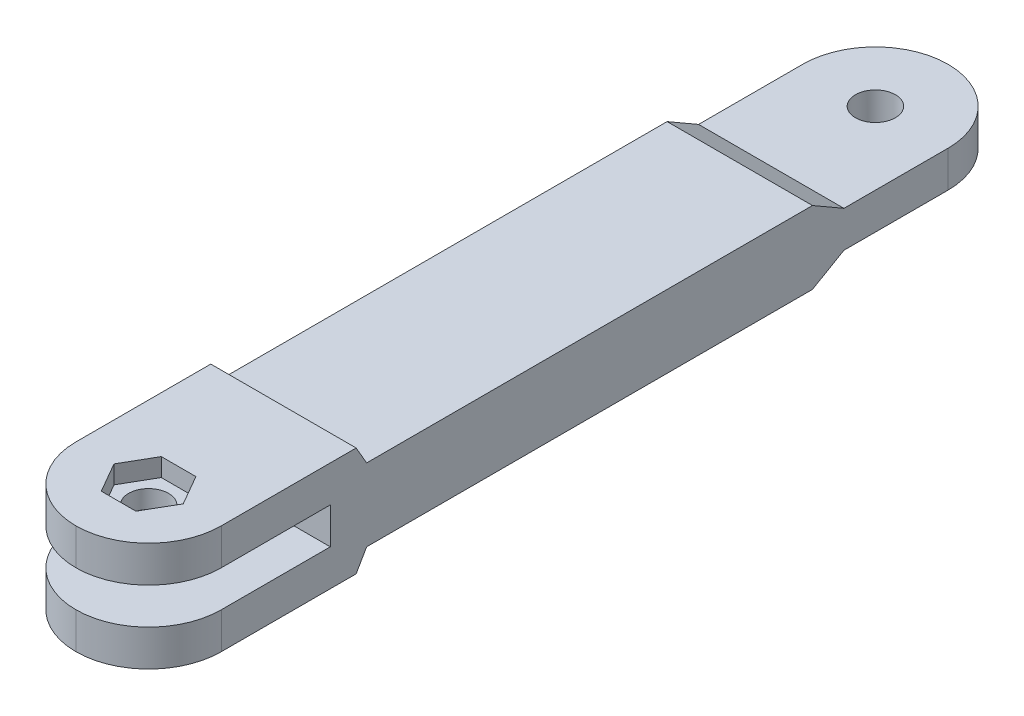
ISO-10303-21;
HEADER;
FILE_DESCRIPTION(('STEP AP214'),'2;1');
FILE_NAME('part.step','',(''),(''),'','','');
FILE_SCHEMA(('AUTOMOTIVE_DESIGN { 1 0 10303 214 1 1 1 1 }'));
ENDSEC;
DATA;
#1=APPLICATION_CONTEXT('core data for automotive mechanical design processes');
#2=APPLICATION_PROTOCOL_DEFINITION('international standard','automotive_design',2000,#1);
#3=PRODUCT_CONTEXT('',#1,'mechanical');
#4=PRODUCT('Part','Part','',(#3));
#5=PRODUCT_RELATED_PRODUCT_CATEGORY('part','',(#4));
#6=PRODUCT_DEFINITION_FORMATION('','',#4);
#7=PRODUCT_DEFINITION_CONTEXT('part definition',#1,'design');
#8=PRODUCT_DEFINITION('design','',#6,#7);
#9=PRODUCT_DEFINITION_SHAPE('','',#8);
#10=(LENGTH_UNIT() NAMED_UNIT(*) SI_UNIT(.MILLI.,.METRE.));
#11=(NAMED_UNIT(*) PLANE_ANGLE_UNIT() SI_UNIT($,.RADIAN.));
#12=(NAMED_UNIT(*) SI_UNIT($,.STERADIAN.) SOLID_ANGLE_UNIT());
#13=UNCERTAINTY_MEASURE_WITH_UNIT(LENGTH_MEASURE(1.E-05),#10,'distance_accuracy_value','');
#14=(GEOMETRIC_REPRESENTATION_CONTEXT(3) GLOBAL_UNCERTAINTY_ASSIGNED_CONTEXT((#13)) GLOBAL_UNIT_ASSIGNED_CONTEXT((#10,
#11,#12)) REPRESENTATION_CONTEXT('',''));
#15=CARTESIAN_POINT('',(0.,0.,0.));
#16=DIRECTION('',(0.,0.,1.));
#17=DIRECTION('',(1.,0.,0.));
#18=AXIS2_PLACEMENT_3D('',#15,#16,#17);
#19=CARTESIAN_POINT('',(-10.,7.5,62.5));
#20=DIRECTION('',(0.,-1.,0.));
#21=DIRECTION('',(0.,0.,-1.));
#22=AXIS2_PLACEMENT_3D('',#19,#20,#21);
#23=PLANE('',#22);
#24=DIRECTION('',(0.,0.,-1.));
#25=VECTOR('',#24,1.);
#26=CARTESIAN_POINT('',(-10.,7.5,62.5));
#27=LINE('',#26,#25);
#28=CARTESIAN_POINT('',(-10.,7.5,52.5));
#29=VERTEX_POINT('',#28);
#30=CARTESIAN_POINT('',(-10.,7.5,33.943375672974));
#31=VERTEX_POINT('',#30);
#32=EDGE_CURVE('E298',#29,#31,#27,.T.);
#33=ORIENTED_EDGE('',*,*,#32,.F.);
#34=CARTESIAN_POINT('',(0.,7.5,52.5));
#35=DIRECTION('',(0.,-1.,0.));
#36=DIRECTION('',(0.,0.,-1.));
#37=AXIS2_PLACEMENT_3D('',#34,#35,#36);
#38=CIRCLE('',#37,10.);
#39=CARTESIAN_POINT('',(0.,7.5,62.5));
#40=VERTEX_POINT('',#39);
#41=EDGE_CURVE('E64',#29,#40,#38,.F.);
#42=ORIENTED_EDGE('',*,*,#41,.T.);
#43=CARTESIAN_POINT('',(0.,7.5,52.5));
#44=DIRECTION('',(0.,-1.,0.));
#45=DIRECTION('',(0.,0.,-1.));
#46=AXIS2_PLACEMENT_3D('',#43,#44,#45);
#47=CIRCLE('',#46,10.);
#48=CARTESIAN_POINT('',(10.,7.5,52.5));
#49=VERTEX_POINT('',#48);
#50=EDGE_CURVE('E455',#40,#49,#47,.F.);
#51=ORIENTED_EDGE('',*,*,#50,.T.);
#52=DIRECTION('',(0.,0.,-1.));
#53=VECTOR('',#52,1.);
#54=CARTESIAN_POINT('',(10.,7.5,62.5));
#55=LINE('',#54,#53);
#56=CARTESIAN_POINT('',(10.,7.5,33.943375672974));
#57=VERTEX_POINT('',#56);
#58=EDGE_CURVE('E301',#49,#57,#55,.T.);
#59=ORIENTED_EDGE('',*,*,#58,.T.);
#60=DIRECTION('',(-1.,0.,0.));
#61=VECTOR('',#60,1.);
#62=CARTESIAN_POINT('',(-10.,7.5,33.943375672974));
#63=LINE('',#62,#61);
#64=EDGE_CURVE('E399',#57,#31,#63,.T.);
#65=ORIENTED_EDGE('',*,*,#64,.T.);
#66=EDGE_LOOP('',(#33,#42,#51,#59,#65));
#67=FACE_BOUND('',#66,.T.);
#68=DIRECTION('',(-1.,0.,0.));
#69=VECTOR('',#68,1.);
#70=CARTESIAN_POINT('',(-10.,7.5,48.375));
#71=LINE('',#70,#69);
#72=CARTESIAN_POINT('',(2.38156986040721,7.5,48.375));
#73=VERTEX_POINT('',#72);
#74=CARTESIAN_POINT('',(-2.38156986040721,7.5,48.375));
#75=VERTEX_POINT('',#74);
#76=EDGE_CURVE('E11',#73,#75,#71,.T.);
#77=ORIENTED_EDGE('',*,*,#76,.F.);
#78=DIRECTION('',(-0.499999999999999,0.,-0.866025403784439));
#79=VECTOR('',#78,1.);
#80=CARTESIAN_POINT('',(5.40248180953301,7.5,53.6073729810778));
#81=LINE('',#80,#79);
#82=CARTESIAN_POINT('',(4.76313972081442,7.5,52.5));
#83=VERTEX_POINT('',#82);
#84=EDGE_CURVE('E466',#83,#73,#81,.T.);
#85=ORIENTED_EDGE('',*,*,#84,.F.);
#86=DIRECTION('',(0.5,0.,-0.866025403784439));
#87=VECTOR('',#86,1.);
#88=CARTESIAN_POINT('',(-3.25777222831138,7.5,66.3926270189222));
#89=LINE('',#88,#87);
#90=CARTESIAN_POINT('',(2.38156986040722,7.5,56.625));
#91=VERTEX_POINT('',#90);
#92=EDGE_CURVE('E484',#91,#83,#89,.T.);
#93=ORIENTED_EDGE('',*,*,#92,.F.);
#94=DIRECTION('',(1.,0.,0.));
#95=VECTOR('',#94,1.);
#96=CARTESIAN_POINT('',(-10.,7.5,56.625));
#97=LINE('',#96,#95);
#98=CARTESIAN_POINT('',(-2.3815698604072,7.5,56.625));
#99=VERTEX_POINT('',#98);
#100=EDGE_CURVE('E487',#99,#91,#97,.T.);
#101=ORIENTED_EDGE('',*,*,#100,.F.);
#102=DIRECTION('',(0.5,0.,0.866025403784439));
#103=VECTOR('',#102,1.);
#104=CARTESIAN_POINT('',(-1.74222777168861,7.5,57.7323729810778));
#105=LINE('',#104,#103);
#106=CARTESIAN_POINT('',(-4.76313972081442,7.5,52.5));
#107=VERTEX_POINT('',#106);
#108=EDGE_CURVE('E490',#107,#99,#105,.T.);
#109=ORIENTED_EDGE('',*,*,#108,.F.);
#110=DIRECTION('',(-0.500000000000001,0.,0.866025403784438));
#111=VECTOR('',#110,1.);
#112=CARTESIAN_POINT('',(-10.402481809533,7.5,62.2676270189222));
#113=LINE('',#112,#111);
#114=EDGE_CURVE('E49',#75,#107,#113,.T.);
#115=ORIENTED_EDGE('',*,*,#114,.F.);
#116=EDGE_LOOP('',(#77,#85,#93,#101,#109,#115));
#117=FACE_BOUND('',#116,.T.);
#118=ADVANCED_FACE('F40',(#67,#117),#23,.F.);
#119=CARTESIAN_POINT('',(0.,-7.5,52.5));
#120=DIRECTION('',(0.,1.,0.));
#121=DIRECTION('',(0.,0.,1.));
#122=AXIS2_PLACEMENT_3D('',#119,#120,#121);
#123=CYLINDRICAL_SURFACE('',#122,2.75);
#124=CARTESIAN_POINT('',(0.,2.5,52.5));
#125=DIRECTION('',(0.,1.,0.));
#126=DIRECTION('',(-1.,0.,0.));
#127=AXIS2_PLACEMENT_3D('',#124,#125,#126);
#128=CIRCLE('',#127,2.75);
#129=CARTESIAN_POINT('',(-2.75,2.5,52.5));
#130=VERTEX_POINT('',#129);
#131=EDGE_CURVE('E267',#130,#130,#128,.T.);
#132=ORIENTED_EDGE('',*,*,#131,.F.);
#133=EDGE_LOOP('',(#132));
#134=FACE_BOUND('',#133,.T.);
#135=CARTESIAN_POINT('',(0.,5.,52.5));
#136=DIRECTION('',(0.,1.,0.));
#137=DIRECTION('',(0.,0.,1.));
#138=AXIS2_PLACEMENT_3D('',#135,#136,#137);
#139=CIRCLE('',#138,2.75);
#140=CARTESIAN_POINT('',(0.,5.,55.25));
#141=VERTEX_POINT('',#140);
#142=EDGE_CURVE('E218',#141,#141,#139,.F.);
#143=ORIENTED_EDGE('',*,*,#142,.F.);
#144=EDGE_LOOP('',(#143));
#145=FACE_BOUND('',#144,.T.);
#146=ADVANCED_FACE('F518',(#134,#145),#123,.F.);
#147=CARTESIAN_POINT('',(0.,0.,37.5));
#148=DIRECTION('',(0.,0.,-1.));
#149=DIRECTION('',(-1.,0.,0.));
#150=AXIS2_PLACEMENT_3D('',#147,#148,#149);
#151=PLANE('',#150);
#152=DIRECTION('',(-1.,0.,0.));
#153=VECTOR('',#152,1.);
#154=CARTESIAN_POINT('',(-10.,-2.5,37.5));
#155=LINE('',#154,#153);
#156=CARTESIAN_POINT('',(10.,-2.5,37.5));
#157=VERTEX_POINT('',#156);
#158=CARTESIAN_POINT('',(-10.,-2.5,37.5));
#159=VERTEX_POINT('',#158);
#160=EDGE_CURVE('E277',#157,#159,#155,.T.);
#161=ORIENTED_EDGE('',*,*,#160,.F.);
#162=DIRECTION('',(0.,1.,0.));
#163=VECTOR('',#162,1.);
#164=CARTESIAN_POINT('',(10.,-5.,37.5));
#165=LINE('',#164,#163);
#166=CARTESIAN_POINT('',(10.,2.5,37.5));
#167=VERTEX_POINT('',#166);
#168=EDGE_CURVE('E327',#157,#167,#165,.T.);
#169=ORIENTED_EDGE('',*,*,#168,.T.);
#170=DIRECTION('',(1.,0.,0.));
#171=VECTOR('',#170,1.);
#172=CARTESIAN_POINT('',(-10.,2.5,37.5));
#173=LINE('',#172,#171);
#174=CARTESIAN_POINT('',(-10.,2.5,37.5));
#175=VERTEX_POINT('',#174);
#176=EDGE_CURVE('E294',#175,#167,#173,.T.);
#177=ORIENTED_EDGE('',*,*,#176,.F.);
#178=DIRECTION('',(0.,-1.,0.));
#179=VECTOR('',#178,1.);
#180=CARTESIAN_POINT('',(-10.,-5.,37.5));
#181=LINE('',#180,#179);
#182=EDGE_CURVE('E323',#175,#159,#181,.T.);
#183=ORIENTED_EDGE('',*,*,#182,.T.);
#184=EDGE_LOOP('',(#161,#169,#177,#183));
#185=FACE_BOUND('',#184,.T.);
#186=ADVANCED_FACE('F524',(#185),#151,.F.);
#187=CARTESIAN_POINT('',(-10.,-5.,-37.5));
#188=DIRECTION('',(-1.,0.,0.));
#189=DIRECTION('',(0.,0.,1.));
#190=AXIS2_PLACEMENT_3D('',#187,#188,#189);
#191=PLANE('',#190);
#192=DIRECTION('',(0.,0.,-1.));
#193=VECTOR('',#192,1.);
#194=CARTESIAN_POINT('',(-10.,-7.5,62.5));
#195=LINE('',#194,#193);
#196=CARTESIAN_POINT('',(-10.,-7.5,52.5));
#197=VERTEX_POINT('',#196);
#198=CARTESIAN_POINT('',(-10.,-7.5,33.943375672974));
#199=VERTEX_POINT('',#198);
#200=EDGE_CURVE('E281',#197,#199,#195,.T.);
#201=ORIENTED_EDGE('',*,*,#200,.F.);
#202=DIRECTION('',(0.,-1.,0.));
#203=VECTOR('',#202,1.);
#204=CARTESIAN_POINT('',(-10.,-5.,52.5));
#205=LINE('',#204,#203);
#206=CARTESIAN_POINT('',(-10.,-2.5,52.5));
#207=VERTEX_POINT('',#206);
#208=EDGE_CURVE('E439',#197,#207,#205,.F.);
#209=ORIENTED_EDGE('',*,*,#208,.T.);
#210=DIRECTION('',(0.,0.,-1.));
#211=VECTOR('',#210,1.);
#212=CARTESIAN_POINT('',(-10.,-2.5,62.5));
#213=LINE('',#212,#211);
#214=EDGE_CURVE('E285',#207,#159,#213,.T.);
#215=ORIENTED_EDGE('',*,*,#214,.T.);
#216=ORIENTED_EDGE('',*,*,#182,.F.);
#217=DIRECTION('',(0.,0.,-1.));
#218=VECTOR('',#217,1.);
#219=CARTESIAN_POINT('',(-10.,2.5,62.5));
#220=LINE('',#219,#218);
#221=CARTESIAN_POINT('',(-10.,2.5,52.5));
#222=VERTEX_POINT('',#221);
#223=EDGE_CURVE('E307',#222,#175,#220,.T.);
#224=ORIENTED_EDGE('',*,*,#223,.F.);
#225=DIRECTION('',(0.,-1.,0.));
#226=VECTOR('',#225,1.);
#227=CARTESIAN_POINT('',(-10.,-5.,52.5));
#228=LINE('',#227,#226);
#229=EDGE_CURVE('E435',#222,#29,#228,.F.);
#230=ORIENTED_EDGE('',*,*,#229,.T.);
#231=ORIENTED_EDGE('',*,*,#32,.T.);
#232=DIRECTION('',(0.,-0.866025403784441,-0.499999999999996));
#233=VECTOR('',#232,1.);
#234=CARTESIAN_POINT('',(-10.,13.6602540378446,37.5));
#235=LINE('',#234,#233);
#236=CARTESIAN_POINT('',(-10.,5.,32.4999999999999));
#237=VERTEX_POINT('',#236);
#238=EDGE_CURVE('E403',#31,#237,#235,.T.);
#239=ORIENTED_EDGE('',*,*,#238,.T.);
#240=DIRECTION('',(0.,0.,1.));
#241=VECTOR('',#240,1.);
#242=CARTESIAN_POINT('',(-10.,5.,-37.5));
#243=LINE('',#242,#241);
#244=CARTESIAN_POINT('',(-10.,5.,-28.8397459621554));
#245=VERTEX_POINT('',#244);
#246=EDGE_CURVE('E332',#245,#237,#243,.T.);
#247=ORIENTED_EDGE('',*,*,#246,.F.);
#248=DIRECTION('',(0.,0.499999999999997,0.866025403784441));
#249=VECTOR('',#248,1.);
#250=CARTESIAN_POINT('',(-10.,-1.25000000000003,-39.6650635094611));
#251=LINE('',#250,#249);
#252=CARTESIAN_POINT('',(-10.,2.5,-33.1698729810777));
#253=VERTEX_POINT('',#252);
#254=EDGE_CURVE('E388',#245,#253,#251,.F.);
#255=ORIENTED_EDGE('',*,*,#254,.T.);
#256=DIRECTION('',(0.,0.,1.));
#257=VECTOR('',#256,1.);
#258=CARTESIAN_POINT('',(-10.,2.5,-57.5));
#259=LINE('',#258,#257);
#260=CARTESIAN_POINT('',(-10.,2.5,-47.5));
#261=VERTEX_POINT('',#260);
#262=EDGE_CURVE('E314',#261,#253,#259,.T.);
#263=ORIENTED_EDGE('',*,*,#262,.F.);
#264=DIRECTION('',(0.,1.,0.));
#265=VECTOR('',#264,1.);
#266=CARTESIAN_POINT('',(-10.,-5.,-47.5));
#267=LINE('',#266,#265);
#268=CARTESIAN_POINT('',(-10.,-2.5,-47.5));
#269=VERTEX_POINT('',#268);
#270=EDGE_CURVE('E353',#261,#269,#267,.F.);
#271=ORIENTED_EDGE('',*,*,#270,.T.);
#272=DIRECTION('',(0.,0.,1.));
#273=VECTOR('',#272,1.);
#274=CARTESIAN_POINT('',(-10.,-2.5,-57.5));
#275=LINE('',#274,#273);
#276=CARTESIAN_POINT('',(-10.,-2.5,-33.1698729810777));
#277=VERTEX_POINT('',#276);
#278=EDGE_CURVE('E317',#269,#277,#275,.T.);
#279=ORIENTED_EDGE('',*,*,#278,.T.);
#280=DIRECTION('',(0.,0.499999999999997,-0.866025403784441));
#281=VECTOR('',#280,1.);
#282=CARTESIAN_POINT('',(-10.,-1.24999999999994,-35.3349364905389));
#283=LINE('',#282,#281);
#284=CARTESIAN_POINT('',(-10.,-5.,-28.8397459621554));
#285=VERTEX_POINT('',#284);
#286=EDGE_CURVE('E385',#277,#285,#283,.F.);
#287=ORIENTED_EDGE('',*,*,#286,.T.);
#288=DIRECTION('',(0.,0.,1.));
#289=VECTOR('',#288,1.);
#290=CARTESIAN_POINT('',(-10.,-5.,-37.5));
#291=LINE('',#290,#289);
#292=CARTESIAN_POINT('',(-10.,-5.,32.4999999999999));
#293=VERTEX_POINT('',#292);
#294=EDGE_CURVE('E331',#285,#293,#291,.T.);
#295=ORIENTED_EDGE('',*,*,#294,.T.);
#296=DIRECTION('',(0.,-0.866025403784441,0.499999999999996));
#297=VECTOR('',#296,1.);
#298=CARTESIAN_POINT('',(-10.,-13.6602540378446,37.5));
#299=LINE('',#298,#297);
#300=EDGE_CURVE('E417',#293,#199,#299,.T.);
#301=ORIENTED_EDGE('',*,*,#300,.T.);
#302=EDGE_LOOP('',(#201,#209,#215,#216,#224,#230,#231,#239,#247,#255,#263,#271,#279,#287,#295,#301));
#303=FACE_BOUND('',#302,.T.);
#304=ADVANCED_FACE('F549',(#303),#191,.T.);
#305=CARTESIAN_POINT('',(-10.,5.,-37.5));
#306=DIRECTION('',(0.,1.,0.));
#307=DIRECTION('',(0.,0.,1.));
#308=AXIS2_PLACEMENT_3D('',#305,#306,#307);
#309=PLANE('',#308);
#310=ORIENTED_EDGE('',*,*,#246,.T.);
#311=DIRECTION('',(1.,0.,0.));
#312=VECTOR('',#311,1.);
#313=CARTESIAN_POINT('',(-10.,5.,32.4999999999999));
#314=LINE('',#313,#312);
#315=CARTESIAN_POINT('',(10.,5.,32.4999999999999));
#316=VERTEX_POINT('',#315);
#317=EDGE_CURVE('E373',#237,#316,#314,.T.);
#318=ORIENTED_EDGE('',*,*,#317,.T.);
#319=DIRECTION('',(0.,0.,1.));
#320=VECTOR('',#319,1.);
#321=CARTESIAN_POINT('',(10.,5.,-37.5));
#322=LINE('',#321,#320);
#323=CARTESIAN_POINT('',(10.,5.,-28.8397459621554));
#324=VERTEX_POINT('',#323);
#325=EDGE_CURVE('E337',#324,#316,#322,.T.);
#326=ORIENTED_EDGE('',*,*,#325,.F.);
#327=DIRECTION('',(-1.,0.,0.));
#328=VECTOR('',#327,1.);
#329=CARTESIAN_POINT('',(-10.,5.,-28.8397459621554));
#330=LINE('',#329,#328);
#331=EDGE_CURVE('E366',#324,#245,#330,.T.);
#332=ORIENTED_EDGE('',*,*,#331,.T.);
#333=EDGE_LOOP('',(#310,#318,#326,#332));
#334=FACE_BOUND('',#333,.T.);
#335=ADVANCED_FACE('F551',(#334),#309,.T.);
#336=CARTESIAN_POINT('',(10.,-5.,-37.5));
#337=DIRECTION('',(1.,0.,0.));
#338=DIRECTION('',(0.,0.,-1.));
#339=AXIS2_PLACEMENT_3D('',#336,#337,#338);
#340=PLANE('',#339);
#341=DIRECTION('',(0.,0.,-1.));
#342=VECTOR('',#341,1.);
#343=CARTESIAN_POINT('',(10.,-2.5,62.5));
#344=LINE('',#343,#342);
#345=CARTESIAN_POINT('',(10.,-2.5,52.5));
#346=VERTEX_POINT('',#345);
#347=EDGE_CURVE('E288',#346,#157,#344,.T.);
#348=ORIENTED_EDGE('',*,*,#347,.F.);
#349=DIRECTION('',(0.,1.,0.));
#350=VECTOR('',#349,1.);
#351=CARTESIAN_POINT('',(10.,-5.,52.5));
#352=LINE('',#351,#350);
#353=CARTESIAN_POINT('',(10.,-7.5,52.5));
#354=VERTEX_POINT('',#353);
#355=EDGE_CURVE('E463',#346,#354,#352,.F.);
#356=ORIENTED_EDGE('',*,*,#355,.T.);
#357=DIRECTION('',(0.,0.,-1.));
#358=VECTOR('',#357,1.);
#359=CARTESIAN_POINT('',(10.,-7.5,62.5));
#360=LINE('',#359,#358);
#361=CARTESIAN_POINT('',(10.,-7.5,33.943375672974));
#362=VERTEX_POINT('',#361);
#363=EDGE_CURVE('E291',#354,#362,#360,.T.);
#364=ORIENTED_EDGE('',*,*,#363,.T.);
#365=DIRECTION('',(0.,0.866025403784441,-0.499999999999996));
#366=VECTOR('',#365,1.);
#367=CARTESIAN_POINT('',(10.,-13.6602540378446,37.5));
#368=LINE('',#367,#366);
#369=CARTESIAN_POINT('',(10.,-5.,32.4999999999999));
#370=VERTEX_POINT('',#369);
#371=EDGE_CURVE('E414',#362,#370,#368,.T.);
#372=ORIENTED_EDGE('',*,*,#371,.T.);
#373=DIRECTION('',(0.,0.,1.));
#374=VECTOR('',#373,1.);
#375=CARTESIAN_POINT('',(10.,-5.,-37.5));
#376=LINE('',#375,#374);
#377=CARTESIAN_POINT('',(10.,-5.,-28.8397459621554));
#378=VERTEX_POINT('',#377);
#379=EDGE_CURVE('E341',#378,#370,#376,.T.);
#380=ORIENTED_EDGE('',*,*,#379,.F.);
#381=DIRECTION('',(0.,-0.499999999999997,0.866025403784441));
#382=VECTOR('',#381,1.);
#383=CARTESIAN_POINT('',(10.,-1.24999999999994,-35.3349364905389));
#384=LINE('',#383,#382);
#385=CARTESIAN_POINT('',(10.,-2.5,-33.1698729810777));
#386=VERTEX_POINT('',#385);
#387=EDGE_CURVE('E392',#378,#386,#384,.F.);
#388=ORIENTED_EDGE('',*,*,#387,.T.);
#389=DIRECTION('',(0.,0.,1.));
#390=VECTOR('',#389,1.);
#391=CARTESIAN_POINT('',(10.,-2.5,-57.5));
#392=LINE('',#391,#390);
#393=CARTESIAN_POINT('',(10.,-2.5,-47.5));
#394=VERTEX_POINT('',#393);
#395=EDGE_CURVE('E320',#394,#386,#392,.T.);
#396=ORIENTED_EDGE('',*,*,#395,.F.);
#397=DIRECTION('',(0.,-1.,0.));
#398=VECTOR('',#397,1.);
#399=CARTESIAN_POINT('',(10.,-5.,-47.5));
#400=LINE('',#399,#398);
#401=CARTESIAN_POINT('',(10.,2.5,-47.5));
#402=VERTEX_POINT('',#401);
#403=EDGE_CURVE('E363',#394,#402,#400,.F.);
#404=ORIENTED_EDGE('',*,*,#403,.T.);
#405=DIRECTION('',(0.,0.,1.));
#406=VECTOR('',#405,1.);
#407=CARTESIAN_POINT('',(10.,2.5,-57.5));
#408=LINE('',#407,#406);
#409=CARTESIAN_POINT('',(10.,2.5,-33.1698729810777));
#410=VERTEX_POINT('',#409);
#411=EDGE_CURVE('E311',#402,#410,#408,.T.);
#412=ORIENTED_EDGE('',*,*,#411,.T.);
#413=DIRECTION('',(0.,-0.499999999999997,-0.866025403784441));
#414=VECTOR('',#413,1.);
#415=CARTESIAN_POINT('',(10.,-1.25000000000003,-39.6650635094611));
#416=LINE('',#415,#414);
#417=EDGE_CURVE('E396',#410,#324,#416,.F.);
#418=ORIENTED_EDGE('',*,*,#417,.T.);
#419=ORIENTED_EDGE('',*,*,#325,.T.);
#420=DIRECTION('',(0.,0.866025403784441,0.499999999999996));
#421=VECTOR('',#420,1.);
#422=CARTESIAN_POINT('',(10.,13.6602540378446,37.5));
#423=LINE('',#422,#421);
#424=EDGE_CURVE('E406',#316,#57,#423,.T.);
#425=ORIENTED_EDGE('',*,*,#424,.T.);
#426=ORIENTED_EDGE('',*,*,#58,.F.);
#427=DIRECTION('',(0.,1.,0.));
#428=VECTOR('',#427,1.);
#429=CARTESIAN_POINT('',(10.,-5.,52.5));
#430=LINE('',#429,#428);
#431=CARTESIAN_POINT('',(10.,2.5,52.5));
#432=VERTEX_POINT('',#431);
#433=EDGE_CURVE('E460',#49,#432,#430,.F.);
#434=ORIENTED_EDGE('',*,*,#433,.T.);
#435=DIRECTION('',(0.,0.,-1.));
#436=VECTOR('',#435,1.);
#437=CARTESIAN_POINT('',(10.,2.5,62.5));
#438=LINE('',#437,#436);
#439=EDGE_CURVE('E304',#432,#167,#438,.T.);
#440=ORIENTED_EDGE('',*,*,#439,.T.);
#441=ORIENTED_EDGE('',*,*,#168,.F.);
#442=EDGE_LOOP('',(#348,#356,#364,#372,#380,#388,#396,#404,#412,#418,#419,#425,#426,#434,#440,#441));
#443=FACE_BOUND('',#442,.T.);
#444=ADVANCED_FACE('F554',(#443),#340,.T.);
#445=CARTESIAN_POINT('',(-10.,-5.,-37.5));
#446=DIRECTION('',(0.,-1.,0.));
#447=DIRECTION('',(0.,0.,-1.));
#448=AXIS2_PLACEMENT_3D('',#445,#446,#447);
#449=PLANE('',#448);
#450=ORIENTED_EDGE('',*,*,#379,.T.);
#451=DIRECTION('',(-1.,0.,0.));
#452=VECTOR('',#451,1.);
#453=CARTESIAN_POINT('',(-10.,-5.,32.4999999999999));
#454=LINE('',#453,#452);
#455=EDGE_CURVE('E381',#370,#293,#454,.T.);
#456=ORIENTED_EDGE('',*,*,#455,.T.);
#457=ORIENTED_EDGE('',*,*,#294,.F.);
#458=DIRECTION('',(1.,0.,0.));
#459=VECTOR('',#458,1.);
#460=CARTESIAN_POINT('',(-10.,-5.,-28.8397459621554));
#461=LINE('',#460,#459);
#462=EDGE_CURVE('E377',#285,#378,#461,.T.);
#463=ORIENTED_EDGE('',*,*,#462,.T.);
#464=EDGE_LOOP('',(#450,#456,#457,#463));
#465=FACE_BOUND('',#464,.T.);
#466=ADVANCED_FACE('F545',(#465),#449,.T.);
#467=CARTESIAN_POINT('',(10.,-2.5,-57.5));
#468=DIRECTION('',(0.,1.,0.));
#469=DIRECTION('',(0.,0.,1.));
#470=AXIS2_PLACEMENT_3D('',#467,#468,#469);
#471=PLANE('',#470);
#472=CARTESIAN_POINT('',(0.,-2.5,-47.5));
#473=DIRECTION('',(0.,1.,0.));
#474=DIRECTION('',(0.,0.,1.));
#475=AXIS2_PLACEMENT_3D('',#472,#473,#474);
#476=CIRCLE('',#475,2.75);
#477=CARTESIAN_POINT('',(0.,-2.5,-44.75));
#478=VERTEX_POINT('',#477);
#479=EDGE_CURVE('E272',#478,#478,#476,.T.);
#480=ORIENTED_EDGE('',*,*,#479,.T.);
#481=EDGE_LOOP('',(#480));
#482=FACE_BOUND('',#481,.T.);
#483=ORIENTED_EDGE('',*,*,#278,.F.);
#484=CARTESIAN_POINT('',(0.,-2.5,-47.5));
#485=DIRECTION('',(0.,1.,0.));
#486=DIRECTION('',(0.,0.,1.));
#487=AXIS2_PLACEMENT_3D('',#484,#485,#486);
#488=CIRCLE('',#487,10.);
#489=CARTESIAN_POINT('',(0.,-2.5,-57.5));
#490=VERTEX_POINT('',#489);
#491=EDGE_CURVE('E360',#269,#490,#488,.F.);
#492=ORIENTED_EDGE('',*,*,#491,.T.);
#493=CARTESIAN_POINT('',(0.,-2.5,-47.5));
#494=DIRECTION('',(0.,1.,0.));
#495=DIRECTION('',(0.,0.,1.));
#496=AXIS2_PLACEMENT_3D('',#493,#494,#495);
#497=CIRCLE('',#496,10.);
#498=EDGE_CURVE('E357',#490,#394,#497,.F.);
#499=ORIENTED_EDGE('',*,*,#498,.T.);
#500=ORIENTED_EDGE('',*,*,#395,.T.);
#501=DIRECTION('',(1.,0.,0.));
#502=VECTOR('',#501,1.);
#503=CARTESIAN_POINT('',(10.,-2.5,-33.1698729810777));
#504=LINE('',#503,#502);
#505=EDGE_CURVE('E425',#386,#277,#504,.F.);
#506=ORIENTED_EDGE('',*,*,#505,.T.);
#507=EDGE_LOOP('',(#483,#492,#499,#500,#506));
#508=FACE_BOUND('',#507,.T.);
#509=ADVANCED_FACE('F541',(#482,#508),#471,.F.);
#510=CARTESIAN_POINT('',(10.,2.5,-57.5));
#511=DIRECTION('',(0.,-1.,0.));
#512=DIRECTION('',(0.,0.,-1.));
#513=AXIS2_PLACEMENT_3D('',#510,#511,#512);
#514=PLANE('',#513);
#515=CARTESIAN_POINT('',(0.,2.5,-47.5));
#516=DIRECTION('',(0.,-1.,0.));
#517=DIRECTION('',(0.,0.,-1.));
#518=AXIS2_PLACEMENT_3D('',#515,#516,#517);
#519=CIRCLE('',#518,2.75);
#520=CARTESIAN_POINT('',(0.,2.5,-50.25));
#521=VERTEX_POINT('',#520);
#522=EDGE_CURVE('E271',#521,#521,#519,.T.);
#523=ORIENTED_EDGE('',*,*,#522,.T.);
#524=EDGE_LOOP('',(#523));
#525=FACE_BOUND('',#524,.T.);
#526=CARTESIAN_POINT('',(0.,2.5,-47.5));
#527=DIRECTION('',(0.,-1.,0.));
#528=DIRECTION('',(0.,0.,-1.));
#529=AXIS2_PLACEMENT_3D('',#526,#527,#528);
#530=CIRCLE('',#529,10.);
#531=CARTESIAN_POINT('',(0.,2.5,-57.5));
#532=VERTEX_POINT('',#531);
#533=EDGE_CURVE('E336',#402,#532,#530,.F.);
#534=ORIENTED_EDGE('',*,*,#533,.T.);
#535=CARTESIAN_POINT('',(0.,2.5,-47.5));
#536=DIRECTION('',(0.,-1.,0.));
#537=DIRECTION('',(0.,0.,-1.));
#538=AXIS2_PLACEMENT_3D('',#535,#536,#537);
#539=CIRCLE('',#538,10.);
#540=EDGE_CURVE('E350',#532,#261,#539,.F.);
#541=ORIENTED_EDGE('',*,*,#540,.T.);
#542=ORIENTED_EDGE('',*,*,#262,.T.);
#543=DIRECTION('',(-1.,0.,0.));
#544=VECTOR('',#543,1.);
#545=CARTESIAN_POINT('',(10.,2.5,-33.1698729810777));
#546=LINE('',#545,#544);
#547=EDGE_CURVE('E421',#253,#410,#546,.F.);
#548=ORIENTED_EDGE('',*,*,#547,.T.);
#549=ORIENTED_EDGE('',*,*,#411,.F.);
#550=EDGE_LOOP('',(#534,#541,#542,#548,#549));
#551=FACE_BOUND('',#550,.T.);
#552=ADVANCED_FACE('F537',(#525,#551),#514,.F.);
#553=CARTESIAN_POINT('',(0.,0.,-47.5));
#554=DIRECTION('',(0.,-1.,0.));
#555=DIRECTION('',(0.,0.,-1.));
#556=AXIS2_PLACEMENT_3D('',#553,#554,#555);
#557=CYLINDRICAL_SURFACE('',#556,10.);
#558=ORIENTED_EDGE('',*,*,#403,.F.);
#559=ORIENTED_EDGE('',*,*,#498,.F.);
#560=DIRECTION('',(0.,-1.,0.));
#561=VECTOR('',#560,1.);
#562=CARTESIAN_POINT('',(0.,0.,-57.5));
#563=LINE('',#562,#561);
#564=EDGE_CURVE('E310',#532,#490,#563,.T.);
#565=ORIENTED_EDGE('',*,*,#564,.F.);
#566=ORIENTED_EDGE('',*,*,#533,.F.);
#567=EDGE_LOOP('',(#558,#559,#565,#566));
#568=FACE_BOUND('',#567,.T.);
#569=ADVANCED_FACE('F540',(#568),#557,.T.);
#570=CARTESIAN_POINT('',(0.,0.,-47.5));
#571=DIRECTION('',(0.,1.,0.));
#572=DIRECTION('',(0.,0.,1.));
#573=AXIS2_PLACEMENT_3D('',#570,#571,#572);
#574=CYLINDRICAL_SURFACE('',#573,10.);
#575=ORIENTED_EDGE('',*,*,#491,.F.);
#576=ORIENTED_EDGE('',*,*,#270,.F.);
#577=ORIENTED_EDGE('',*,*,#540,.F.);
#578=ORIENTED_EDGE('',*,*,#564,.T.);
#579=EDGE_LOOP('',(#575,#576,#577,#578));
#580=FACE_BOUND('',#579,.T.);
#581=ADVANCED_FACE('F535',(#580),#574,.T.);
#582=CARTESIAN_POINT('',(-10.,2.5,62.5));
#583=DIRECTION('',(0.,1.,0.));
#584=DIRECTION('',(-1.,0.,0.));
#585=AXIS2_PLACEMENT_3D('',#582,#583,#584);
#586=PLANE('',#585);
#587=ORIENTED_EDGE('',*,*,#131,.T.);
#588=EDGE_LOOP('',(#587));
#589=FACE_BOUND('',#588,.T.);
#590=CARTESIAN_POINT('',(0.,2.5,52.5));
#591=DIRECTION('',(0.,1.,0.));
#592=DIRECTION('',(-1.,0.,0.));
#593=AXIS2_PLACEMENT_3D('',#590,#591,#592);
#594=CIRCLE('',#593,10.);
#595=CARTESIAN_POINT('',(0.,2.5,62.5));
#596=VERTEX_POINT('',#595);
#597=EDGE_CURVE('E449',#432,#596,#594,.F.);
#598=ORIENTED_EDGE('',*,*,#597,.T.);
#599=CARTESIAN_POINT('',(0.,2.5,52.5));
#600=DIRECTION('',(0.,1.,0.));
#601=DIRECTION('',(-1.,0.,0.));
#602=AXIS2_PLACEMENT_3D('',#599,#600,#601);
#603=CIRCLE('',#602,10.);
#604=EDGE_CURVE('E452',#596,#222,#603,.F.);
#605=ORIENTED_EDGE('',*,*,#604,.T.);
#606=ORIENTED_EDGE('',*,*,#223,.T.);
#607=ORIENTED_EDGE('',*,*,#176,.T.);
#608=ORIENTED_EDGE('',*,*,#439,.F.);
#609=EDGE_LOOP('',(#598,#605,#606,#607,#608));
#610=FACE_BOUND('',#609,.T.);
#611=ADVANCED_FACE('F532',(#589,#610),#586,.F.);
#612=CARTESIAN_POINT('',(-10.,-7.5,62.5));
#613=DIRECTION('',(0.,1.,0.));
#614=DIRECTION('',(0.,0.,1.));
#615=AXIS2_PLACEMENT_3D('',#612,#613,#614);
#616=PLANE('',#615);
#617=CARTESIAN_POINT('',(0.,-7.5,52.5));
#618=DIRECTION('',(0.,1.,0.));
#619=DIRECTION('',(0.,0.,1.));
#620=AXIS2_PLACEMENT_3D('',#617,#618,#619);
#621=CIRCLE('',#620,2.75);
#622=CARTESIAN_POINT('',(0.,-7.5,55.25));
#623=VERTEX_POINT('',#622);
#624=EDGE_CURVE('E262',#623,#623,#621,.T.);
#625=ORIENTED_EDGE('',*,*,#624,.T.);
#626=EDGE_LOOP('',(#625));
#627=FACE_BOUND('',#626,.T.);
#628=CARTESIAN_POINT('',(0.,-7.5,52.5));
#629=DIRECTION('',(0.,1.,0.));
#630=DIRECTION('',(0.,0.,1.));
#631=AXIS2_PLACEMENT_3D('',#628,#629,#630);
#632=CIRCLE('',#631,10.);
#633=CARTESIAN_POINT('',(0.,-7.5,62.5));
#634=VERTEX_POINT('',#633);
#635=EDGE_CURVE('E429',#354,#634,#632,.F.);
#636=ORIENTED_EDGE('',*,*,#635,.T.);
#637=CARTESIAN_POINT('',(0.,-7.5,52.5));
#638=DIRECTION('',(0.,1.,0.));
#639=DIRECTION('',(0.,0.,1.));
#640=AXIS2_PLACEMENT_3D('',#637,#638,#639);
#641=CIRCLE('',#640,10.);
#642=EDGE_CURVE('E432',#634,#197,#641,.F.);
#643=ORIENTED_EDGE('',*,*,#642,.T.);
#644=ORIENTED_EDGE('',*,*,#200,.T.);
#645=DIRECTION('',(1.,0.,0.));
#646=VECTOR('',#645,1.);
#647=CARTESIAN_POINT('',(-10.,-7.5,33.943375672974));
#648=LINE('',#647,#646);
#649=EDGE_CURVE('E410',#199,#362,#648,.T.);
#650=ORIENTED_EDGE('',*,*,#649,.T.);
#651=ORIENTED_EDGE('',*,*,#363,.F.);
#652=EDGE_LOOP('',(#636,#643,#644,#650,#651));
#653=FACE_BOUND('',#652,.T.);
#654=ADVANCED_FACE('F530',(#627,#653),#616,.F.);
#655=CARTESIAN_POINT('',(-10.,-2.5,62.5));
#656=DIRECTION('',(0.,-1.,0.));
#657=DIRECTION('',(1.,0.,0.));
#658=AXIS2_PLACEMENT_3D('',#655,#656,#657);
#659=PLANE('',#658);
#660=CARTESIAN_POINT('',(0.,-2.5,52.5));
#661=DIRECTION('',(0.,-1.,0.));
#662=DIRECTION('',(1.,0.,0.));
#663=AXIS2_PLACEMENT_3D('',#660,#661,#662);
#664=CIRCLE('',#663,2.75);
#665=CARTESIAN_POINT('',(2.75,-2.5,52.5));
#666=VERTEX_POINT('',#665);
#667=EDGE_CURVE('E266',#666,#666,#664,.T.);
#668=ORIENTED_EDGE('',*,*,#667,.T.);
#669=EDGE_LOOP('',(#668));
#670=FACE_BOUND('',#669,.T.);
#671=ORIENTED_EDGE('',*,*,#214,.F.);
#672=CARTESIAN_POINT('',(0.,-2.5,52.5));
#673=DIRECTION('',(0.,-1.,0.));
#674=DIRECTION('',(1.,0.,0.));
#675=AXIS2_PLACEMENT_3D('',#672,#673,#674);
#676=CIRCLE('',#675,10.);
#677=CARTESIAN_POINT('',(0.,-2.5,62.5));
#678=VERTEX_POINT('',#677);
#679=EDGE_CURVE('E446',#207,#678,#676,.F.);
#680=ORIENTED_EDGE('',*,*,#679,.T.);
#681=CARTESIAN_POINT('',(0.,-2.5,52.5));
#682=DIRECTION('',(0.,-1.,0.));
#683=DIRECTION('',(1.,0.,0.));
#684=AXIS2_PLACEMENT_3D('',#681,#682,#683);
#685=CIRCLE('',#684,10.);
#686=EDGE_CURVE('E443',#678,#346,#685,.F.);
#687=ORIENTED_EDGE('',*,*,#686,.T.);
#688=ORIENTED_EDGE('',*,*,#347,.T.);
#689=ORIENTED_EDGE('',*,*,#160,.T.);
#690=EDGE_LOOP('',(#671,#680,#687,#688,#689));
#691=FACE_BOUND('',#690,.T.);
#692=ADVANCED_FACE('F575',(#670,#691),#659,.F.);
#693=CARTESIAN_POINT('',(0.,13.6602540378446,37.5));
#694=DIRECTION('',(0.,-0.499999999999996,0.866025403784441));
#695=DIRECTION('',(-1.,0.,0.));
#696=AXIS2_PLACEMENT_3D('',#693,#694,#695);
#697=PLANE('',#696);
#698=ORIENTED_EDGE('',*,*,#424,.F.);
#699=ORIENTED_EDGE('',*,*,#317,.F.);
#700=ORIENTED_EDGE('',*,*,#238,.F.);
#701=ORIENTED_EDGE('',*,*,#64,.F.);
#702=EDGE_LOOP('',(#698,#699,#700,#701));
#703=FACE_BOUND('',#702,.T.);
#704=ADVANCED_FACE('F571',(#703),#697,.F.);
#705=CARTESIAN_POINT('',(0.,-13.6602540378446,37.5));
#706=DIRECTION('',(0.,0.499999999999996,0.866025403784441));
#707=DIRECTION('',(1.,0.,0.));
#708=AXIS2_PLACEMENT_3D('',#705,#706,#707);
#709=PLANE('',#708);
#710=ORIENTED_EDGE('',*,*,#300,.F.);
#711=ORIENTED_EDGE('',*,*,#455,.F.);
#712=ORIENTED_EDGE('',*,*,#371,.F.);
#713=ORIENTED_EDGE('',*,*,#649,.F.);
#714=EDGE_LOOP('',(#710,#711,#712,#713));
#715=FACE_BOUND('',#714,.T.);
#716=ADVANCED_FACE('F574',(#715),#709,.F.);
#717=CARTESIAN_POINT('',(-10.,5.,-28.8397459621554));
#718=DIRECTION('',(0.,-0.866025403784441,0.499999999999996));
#719=DIRECTION('',(-1.,0.,0.));
#720=AXIS2_PLACEMENT_3D('',#717,#718,#719);
#721=PLANE('',#720);
#722=ORIENTED_EDGE('',*,*,#417,.F.);
#723=ORIENTED_EDGE('',*,*,#547,.F.);
#724=ORIENTED_EDGE('',*,*,#254,.F.);
#725=ORIENTED_EDGE('',*,*,#331,.F.);
#726=EDGE_LOOP('',(#722,#723,#724,#725));
#727=FACE_BOUND('',#726,.T.);
#728=ADVANCED_FACE('F579',(#727),#721,.F.);
#729=CARTESIAN_POINT('',(-10.,-5.,-28.8397459621554));
#730=DIRECTION('',(0.,0.866025403784441,0.499999999999996));
#731=DIRECTION('',(1.,0.,0.));
#732=AXIS2_PLACEMENT_3D('',#729,#730,#731);
#733=PLANE('',#732);
#734=ORIENTED_EDGE('',*,*,#286,.F.);
#735=ORIENTED_EDGE('',*,*,#505,.F.);
#736=ORIENTED_EDGE('',*,*,#387,.F.);
#737=ORIENTED_EDGE('',*,*,#462,.F.);
#738=EDGE_LOOP('',(#734,#735,#736,#737));
#739=FACE_BOUND('',#738,.T.);
#740=ADVANCED_FACE('F583',(#739),#733,.F.);
#741=CARTESIAN_POINT('',(0.,0.,52.5));
#742=DIRECTION('',(0.,1.,0.));
#743=DIRECTION('',(0.,0.,1.));
#744=AXIS2_PLACEMENT_3D('',#741,#742,#743);
#745=CYLINDRICAL_SURFACE('',#744,10.);
#746=ORIENTED_EDGE('',*,*,#355,.F.);
#747=ORIENTED_EDGE('',*,*,#686,.F.);
#748=DIRECTION('',(0.,1.,0.));
#749=VECTOR('',#748,1.);
#750=CARTESIAN_POINT('',(0.,0.,62.5));
#751=LINE('',#750,#749);
#752=EDGE_CURVE('E282',#634,#678,#751,.T.);
#753=ORIENTED_EDGE('',*,*,#752,.F.);
#754=ORIENTED_EDGE('',*,*,#635,.F.);
#755=EDGE_LOOP('',(#746,#747,#753,#754));
#756=FACE_BOUND('',#755,.T.);
#757=ADVANCED_FACE('F587',(#756),#745,.T.);
#758=CARTESIAN_POINT('',(0.,0.,52.5));
#759=DIRECTION('',(0.,-1.,0.));
#760=DIRECTION('',(0.,0.,-1.));
#761=AXIS2_PLACEMENT_3D('',#758,#759,#760);
#762=CYLINDRICAL_SURFACE('',#761,10.);
#763=ORIENTED_EDGE('',*,*,#679,.F.);
#764=ORIENTED_EDGE('',*,*,#208,.F.);
#765=ORIENTED_EDGE('',*,*,#642,.F.);
#766=ORIENTED_EDGE('',*,*,#752,.T.);
#767=EDGE_LOOP('',(#763,#764,#765,#766));
#768=FACE_BOUND('',#767,.T.);
#769=ADVANCED_FACE('F589',(#768),#762,.T.);
#770=CARTESIAN_POINT('',(0.,0.,52.5));
#771=DIRECTION('',(0.,1.,0.));
#772=DIRECTION('',(0.,0.,1.));
#773=AXIS2_PLACEMENT_3D('',#770,#771,#772);
#774=CYLINDRICAL_SURFACE('',#773,10.);
#775=ORIENTED_EDGE('',*,*,#433,.F.);
#776=ORIENTED_EDGE('',*,*,#50,.F.);
#777=DIRECTION('',(0.,1.,0.));
#778=VECTOR('',#777,1.);
#779=CARTESIAN_POINT('',(0.,0.,62.5));
#780=LINE('',#779,#778);
#781=EDGE_CURVE('E276',#596,#40,#780,.T.);
#782=ORIENTED_EDGE('',*,*,#781,.F.);
#783=ORIENTED_EDGE('',*,*,#597,.F.);
#784=EDGE_LOOP('',(#775,#776,#782,#783));
#785=FACE_BOUND('',#784,.T.);
#786=ADVANCED_FACE('F42',(#785),#774,.T.);
#787=CARTESIAN_POINT('',(0.,0.,52.5));
#788=DIRECTION('',(0.,-1.,0.));
#789=DIRECTION('',(0.,0.,-1.));
#790=AXIS2_PLACEMENT_3D('',#787,#788,#789);
#791=CYLINDRICAL_SURFACE('',#790,10.);
#792=ORIENTED_EDGE('',*,*,#41,.F.);
#793=ORIENTED_EDGE('',*,*,#229,.F.);
#794=ORIENTED_EDGE('',*,*,#604,.F.);
#795=ORIENTED_EDGE('',*,*,#781,.T.);
#796=EDGE_LOOP('',(#792,#793,#794,#795));
#797=FACE_BOUND('',#796,.T.);
#798=ADVANCED_FACE('F595',(#797),#791,.T.);
#799=ORIENTED_EDGE('',*,*,#624,.F.);
#800=EDGE_LOOP('',(#799));
#801=FACE_BOUND('',#800,.T.);
#802=ORIENTED_EDGE('',*,*,#667,.F.);
#803=EDGE_LOOP('',(#802));
#804=FACE_BOUND('',#803,.T.);
#805=ADVANCED_FACE('F527',(#801,#804),#123,.F.);
#806=CARTESIAN_POINT('',(0.,-7.5,-47.5));
#807=DIRECTION('',(0.,1.,0.));
#808=DIRECTION('',(0.,0.,1.));
#809=AXIS2_PLACEMENT_3D('',#806,#807,#808);
#810=CYLINDRICAL_SURFACE('',#809,2.75);
#811=ORIENTED_EDGE('',*,*,#522,.F.);
#812=EDGE_LOOP('',(#811));
#813=FACE_BOUND('',#812,.T.);
#814=ORIENTED_EDGE('',*,*,#479,.F.);
#815=EDGE_LOOP('',(#814));
#816=FACE_BOUND('',#815,.T.);
#817=ADVANCED_FACE('F602',(#813,#816),#810,.F.);
#818=CARTESIAN_POINT('',(2.38156986040721,7.500012,48.375));
#819=DIRECTION('',(0.,0.,1.));
#820=DIRECTION('',(1.,0.,0.));
#821=AXIS2_PLACEMENT_3D('',#818,#819,#820);
#822=PLANE('',#821);
#823=ORIENTED_EDGE('',*,*,#76,.T.);
#824=DIRECTION('',(0.,-1.,0.));
#825=VECTOR('',#824,1.);
#826=CARTESIAN_POINT('',(-2.38156986040721,7.500012,48.375));
#827=LINE('',#826,#825);
#828=CARTESIAN_POINT('',(-2.38156986040721,5.,48.375));
#829=VERTEX_POINT('',#828);
#830=EDGE_CURVE('E207',#75,#829,#827,.T.);
#831=ORIENTED_EDGE('',*,*,#830,.T.);
#832=DIRECTION('',(-1.,0.,0.));
#833=VECTOR('',#832,1.);
#834=CARTESIAN_POINT('',(2.38156986040721,5.,48.375));
#835=LINE('',#834,#833);
#836=CARTESIAN_POINT('',(2.38156986040721,5.,48.375));
#837=VERTEX_POINT('',#836);
#838=EDGE_CURVE('E212',#837,#829,#835,.T.);
#839=ORIENTED_EDGE('',*,*,#838,.F.);
#840=DIRECTION('',(0.,-1.,0.));
#841=VECTOR('',#840,1.);
#842=CARTESIAN_POINT('',(2.38156986040721,7.500012,48.375));
#843=LINE('',#842,#841);
#844=EDGE_CURVE('E249',#73,#837,#843,.T.);
#845=ORIENTED_EDGE('',*,*,#844,.F.);
#846=EDGE_LOOP('',(#823,#831,#839,#845));
#847=FACE_BOUND('',#846,.T.);
#848=ADVANCED_FACE('F209',(#847),#822,.T.);
#849=CARTESIAN_POINT('',(-2.38156986040721,7.500012,48.375));
#850=DIRECTION('',(0.866025403784438,0.,0.500000000000001));
#851=DIRECTION('',(0.500000000000001,0.,-0.866025403784438));
#852=AXIS2_PLACEMENT_3D('',#849,#850,#851);
#853=PLANE('',#852);
#854=ORIENTED_EDGE('',*,*,#114,.T.);
#855=DIRECTION('',(0.,-1.,0.));
#856=VECTOR('',#855,1.);
#857=CARTESIAN_POINT('',(-4.76313972081442,7.500012,52.5));
#858=LINE('',#857,#856);
#859=CARTESIAN_POINT('',(-4.76313972081442,5.,52.5));
#860=VERTEX_POINT('',#859);
#861=EDGE_CURVE('E219',#107,#860,#858,.T.);
#862=ORIENTED_EDGE('',*,*,#861,.T.);
#863=DIRECTION('',(-0.500000000000001,0.,0.866025403784438));
#864=VECTOR('',#863,1.);
#865=CARTESIAN_POINT('',(-2.38156986040721,5.,48.375));
#866=LINE('',#865,#864);
#867=EDGE_CURVE('E222',#829,#860,#866,.T.);
#868=ORIENTED_EDGE('',*,*,#867,.F.);
#869=ORIENTED_EDGE('',*,*,#830,.F.);
#870=EDGE_LOOP('',(#854,#862,#868,#869));
#871=FACE_BOUND('',#870,.T.);
#872=ADVANCED_FACE('F223',(#871),#853,.T.);
#873=CARTESIAN_POINT('',(-4.76313972081442,7.500012,52.5));
#874=DIRECTION('',(0.866025403784439,0.,-0.5));
#875=DIRECTION('',(-0.5,0.,-0.866025403784439));
#876=AXIS2_PLACEMENT_3D('',#873,#874,#875);
#877=PLANE('',#876);
#878=ORIENTED_EDGE('',*,*,#108,.T.);
#879=DIRECTION('',(0.,-1.,0.));
#880=VECTOR('',#879,1.);
#881=CARTESIAN_POINT('',(-2.3815698604072,7.500012,56.625));
#882=LINE('',#881,#880);
#883=CARTESIAN_POINT('',(-2.3815698604072,5.,56.625));
#884=VERTEX_POINT('',#883);
#885=EDGE_CURVE('E257',#99,#884,#882,.T.);
#886=ORIENTED_EDGE('',*,*,#885,.T.);
#887=DIRECTION('',(0.5,0.,0.866025403784439));
#888=VECTOR('',#887,1.);
#889=CARTESIAN_POINT('',(-4.76313972081442,5.,52.5));
#890=LINE('',#889,#888);
#891=EDGE_CURVE('E229',#860,#884,#890,.T.);
#892=ORIENTED_EDGE('',*,*,#891,.F.);
#893=ORIENTED_EDGE('',*,*,#861,.F.);
#894=EDGE_LOOP('',(#878,#886,#892,#893));
#895=FACE_BOUND('',#894,.T.);
#896=ADVANCED_FACE('F496',(#895),#877,.T.);
#897=CARTESIAN_POINT('',(-2.3815698604072,7.500012,56.625));
#898=DIRECTION('',(0.,0.,-1.));
#899=DIRECTION('',(-1.,0.,0.));
#900=AXIS2_PLACEMENT_3D('',#897,#898,#899);
#901=PLANE('',#900);
#902=ORIENTED_EDGE('',*,*,#100,.T.);
#903=DIRECTION('',(0.,-1.,0.));
#904=VECTOR('',#903,1.);
#905=CARTESIAN_POINT('',(2.38156986040722,7.500012,56.625));
#906=LINE('',#905,#904);
#907=CARTESIAN_POINT('',(2.38156986040722,5.,56.625));
#908=VERTEX_POINT('',#907);
#909=EDGE_CURVE('E254',#91,#908,#906,.T.);
#910=ORIENTED_EDGE('',*,*,#909,.T.);
#911=DIRECTION('',(1.,0.,0.));
#912=VECTOR('',#911,1.);
#913=CARTESIAN_POINT('',(-2.3815698604072,5.,56.625));
#914=LINE('',#913,#912);
#915=EDGE_CURVE('E240',#884,#908,#914,.T.);
#916=ORIENTED_EDGE('',*,*,#915,.F.);
#917=ORIENTED_EDGE('',*,*,#885,.F.);
#918=EDGE_LOOP('',(#902,#910,#916,#917));
#919=FACE_BOUND('',#918,.T.);
#920=ADVANCED_FACE('F503',(#919),#901,.T.);
#921=CARTESIAN_POINT('',(2.38156986040722,7.500012,56.625));
#922=DIRECTION('',(-0.866025403784439,0.,-0.5));
#923=DIRECTION('',(-0.5,0.,0.866025403784439));
#924=AXIS2_PLACEMENT_3D('',#921,#922,#923);
#925=PLANE('',#924);
#926=ORIENTED_EDGE('',*,*,#92,.T.);
#927=DIRECTION('',(0.,-1.,0.));
#928=VECTOR('',#927,1.);
#929=CARTESIAN_POINT('',(4.76313972081442,7.500012,52.5));
#930=LINE('',#929,#928);
#931=CARTESIAN_POINT('',(4.76313972081442,5.,52.5));
#932=VERTEX_POINT('',#931);
#933=EDGE_CURVE('E56',#83,#932,#930,.T.);
#934=ORIENTED_EDGE('',*,*,#933,.T.);
#935=DIRECTION('',(0.5,0.,-0.866025403784439));
#936=VECTOR('',#935,1.);
#937=CARTESIAN_POINT('',(2.38156986040722,5.,56.625));
#938=LINE('',#937,#936);
#939=EDGE_CURVE('E244',#908,#932,#938,.T.);
#940=ORIENTED_EDGE('',*,*,#939,.F.);
#941=ORIENTED_EDGE('',*,*,#909,.F.);
#942=EDGE_LOOP('',(#926,#934,#940,#941));
#943=FACE_BOUND('',#942,.T.);
#944=ADVANCED_FACE('F507',(#943),#925,.T.);
#945=CARTESIAN_POINT('',(4.76313972081442,7.500012,52.5));
#946=DIRECTION('',(-0.866025403784439,0.,0.499999999999999));
#947=DIRECTION('',(0.499999999999999,0.,0.866025403784439));
#948=AXIS2_PLACEMENT_3D('',#945,#946,#947);
#949=PLANE('',#948);
#950=ORIENTED_EDGE('',*,*,#84,.T.);
#951=ORIENTED_EDGE('',*,*,#844,.T.);
#952=DIRECTION('',(-0.499999999999999,0.,-0.866025403784439));
#953=VECTOR('',#952,1.);
#954=CARTESIAN_POINT('',(4.76313972081442,5.,52.5));
#955=LINE('',#954,#953);
#956=EDGE_CURVE('E234',#932,#837,#955,.T.);
#957=ORIENTED_EDGE('',*,*,#956,.F.);
#958=ORIENTED_EDGE('',*,*,#933,.F.);
#959=EDGE_LOOP('',(#950,#951,#957,#958));
#960=FACE_BOUND('',#959,.T.);
#961=ADVANCED_FACE('F508',(#960),#949,.T.);
#962=CARTESIAN_POINT('',(0.,5.,0.));
#963=DIRECTION('',(0.,1.,0.));
#964=DIRECTION('',(0.,0.,1.));
#965=AXIS2_PLACEMENT_3D('',#962,#963,#964);
#966=PLANE('',#965);
#967=ORIENTED_EDGE('',*,*,#838,.T.);
#968=ORIENTED_EDGE('',*,*,#867,.T.);
#969=ORIENTED_EDGE('',*,*,#891,.T.);
#970=ORIENTED_EDGE('',*,*,#915,.T.);
#971=ORIENTED_EDGE('',*,*,#939,.T.);
#972=ORIENTED_EDGE('',*,*,#956,.T.);
#973=EDGE_LOOP('',(#967,#968,#969,#970,#971,#972));
#974=FACE_BOUND('',#973,.T.);
#975=ORIENTED_EDGE('',*,*,#142,.T.);
#976=EDGE_LOOP('',(#975));
#977=FACE_BOUND('',#976,.T.);
#978=ADVANCED_FACE('F231',(#974,#977),#966,.T.);
#979=CLOSED_SHELL('',(#118,#146,#186,#304,#335,#444,#466,#509,#552,#569,#581,#611,#654,#692,
#704,#716,#728,#740,#757,#769,#786,#798,#805,#817,#848,#872,#896,#920,#944,#961,#978));
#980=MANIFOLD_SOLID_BREP('B2',#979);
#981=ADVANCED_BREP_SHAPE_REPRESENTATION('',(#18,#980),#14);
#982=SHAPE_DEFINITION_REPRESENTATION(#9,#981);
ENDSEC;
END-ISO-10303-21;
